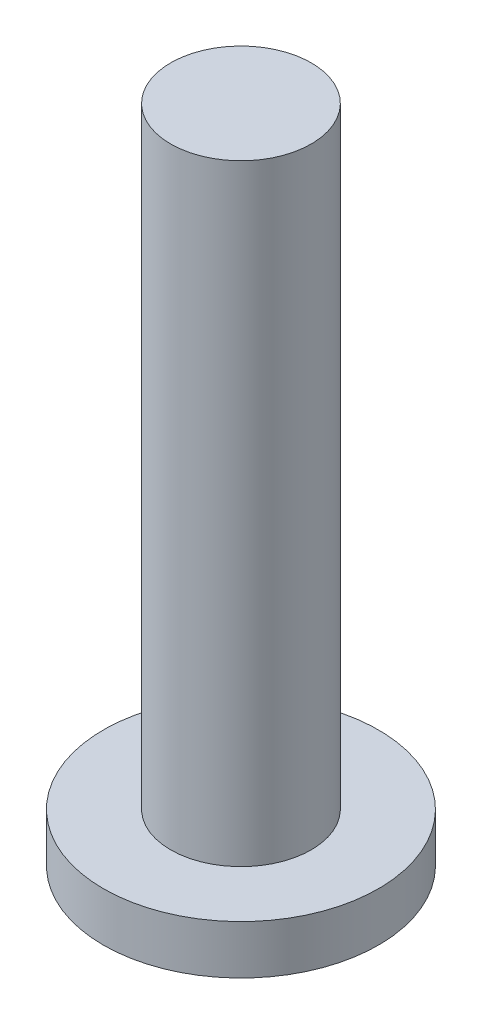
ISO-10303-21;
HEADER;
FILE_DESCRIPTION(('STEP AP214'),'2;1');
FILE_NAME('part.step','',(''),(''),'','','');
FILE_SCHEMA(('AUTOMOTIVE_DESIGN { 1 0 10303 214 1 1 1 1 }'));
ENDSEC;
DATA;
#1=APPLICATION_CONTEXT('core data for automotive mechanical design processes');
#2=APPLICATION_PROTOCOL_DEFINITION('international standard','automotive_design',2000,#1);
#3=PRODUCT_CONTEXT('',#1,'mechanical');
#4=PRODUCT('Part','Part','',(#3));
#5=PRODUCT_RELATED_PRODUCT_CATEGORY('part','',(#4));
#6=PRODUCT_DEFINITION_FORMATION('','',#4);
#7=PRODUCT_DEFINITION_CONTEXT('part definition',#1,'design');
#8=PRODUCT_DEFINITION('design','',#6,#7);
#9=PRODUCT_DEFINITION_SHAPE('','',#8);
#10=(LENGTH_UNIT() NAMED_UNIT(*) SI_UNIT(.MILLI.,.METRE.));
#11=(NAMED_UNIT(*) PLANE_ANGLE_UNIT() SI_UNIT($,.RADIAN.));
#12=(NAMED_UNIT(*) SI_UNIT($,.STERADIAN.) SOLID_ANGLE_UNIT());
#13=UNCERTAINTY_MEASURE_WITH_UNIT(LENGTH_MEASURE(1.E-05),#10,'distance_accuracy_value','');
#14=(GEOMETRIC_REPRESENTATION_CONTEXT(3) GLOBAL_UNCERTAINTY_ASSIGNED_CONTEXT((#13)) GLOBAL_UNIT_ASSIGNED_CONTEXT((#10,
#11,#12)) REPRESENTATION_CONTEXT('',''));
#15=CARTESIAN_POINT('',(0.,0.,0.));
#16=DIRECTION('',(0.,0.,1.));
#17=DIRECTION('',(1.,0.,0.));
#18=AXIS2_PLACEMENT_3D('',#15,#16,#17);
#19=CARTESIAN_POINT('',(0.,1.016,0.));
#20=DIRECTION('',(0.,1.,0.));
#21=DIRECTION('',(0.,0.,1.));
#22=AXIS2_PLACEMENT_3D('',#19,#20,#21);
#23=PLANE('',#22);
#24=CARTESIAN_POINT('',(0.,1.016,0.));
#25=DIRECTION('',(0.,1.,0.));
#26=DIRECTION('',(0.,0.,1.));
#27=AXIS2_PLACEMENT_3D('',#24,#25,#26);
#28=CIRCLE('',#27,2.8575);
#29=CARTESIAN_POINT('',(0.,1.016,2.8575));
#30=VERTEX_POINT('',#29);
#31=EDGE_CURVE('E10',#30,#30,#28,.T.);
#32=ORIENTED_EDGE('',*,*,#31,.T.);
#33=EDGE_LOOP('',(#32));
#34=FACE_BOUND('',#33,.T.);
#35=CARTESIAN_POINT('',(0.,1.016,0.));
#36=DIRECTION('',(0.,1.,0.));
#37=DIRECTION('',(0.,0.,1.));
#38=AXIS2_PLACEMENT_3D('',#35,#36,#37);
#39=CIRCLE('',#38,1.4605);
#40=CARTESIAN_POINT('',(0.,1.016,1.4605));
#41=VERTEX_POINT('',#40);
#42=EDGE_CURVE('E46',#41,#41,#39,.T.);
#43=ORIENTED_EDGE('',*,*,#42,.F.);
#44=EDGE_LOOP('',(#43));
#45=FACE_BOUND('',#44,.T.);
#46=ADVANCED_FACE('F35',(#34,#45),#23,.T.);
#47=CARTESIAN_POINT('',(0.,0.,0.));
#48=DIRECTION('',(0.,1.,0.));
#49=DIRECTION('',(0.,0.,1.));
#50=AXIS2_PLACEMENT_3D('',#47,#48,#49);
#51=PLANE('',#50);
#52=CARTESIAN_POINT('',(0.,0.,0.));
#53=DIRECTION('',(0.,1.,0.));
#54=DIRECTION('',(0.,0.,1.));
#55=AXIS2_PLACEMENT_3D('',#52,#53,#54);
#56=CIRCLE('',#55,2.8575);
#57=CARTESIAN_POINT('',(0.,0.,2.8575));
#58=VERTEX_POINT('',#57);
#59=EDGE_CURVE('E39',#58,#58,#56,.T.);
#60=ORIENTED_EDGE('',*,*,#59,.F.);
#61=EDGE_LOOP('',(#60));
#62=FACE_BOUND('',#61,.T.);
#63=ADVANCED_FACE('F65',(#62),#51,.F.);
#64=CARTESIAN_POINT('',(0.,1.016,0.));
#65=DIRECTION('',(0.,-1.,0.));
#66=DIRECTION('',(0.,0.,-1.));
#67=AXIS2_PLACEMENT_3D('',#64,#65,#66);
#68=CYLINDRICAL_SURFACE('',#67,2.8575);
#69=ORIENTED_EDGE('',*,*,#31,.F.);
#70=EDGE_LOOP('',(#69));
#71=FACE_BOUND('',#70,.T.);
#72=ORIENTED_EDGE('',*,*,#59,.T.);
#73=EDGE_LOOP('',(#72));
#74=FACE_BOUND('',#73,.T.);
#75=ADVANCED_FACE('F37',(#71,#74),#68,.T.);
#76=CARTESIAN_POINT('',(0.,13.716,0.));
#77=DIRECTION('',(0.,-1.,0.));
#78=DIRECTION('',(0.,0.,-1.));
#79=AXIS2_PLACEMENT_3D('',#76,#77,#78);
#80=CYLINDRICAL_SURFACE('',#79,1.4605);
#81=ORIENTED_EDGE('',*,*,#42,.T.);
#82=EDGE_LOOP('',(#81));
#83=FACE_BOUND('',#82,.T.);
#84=CARTESIAN_POINT('',(0.,13.716,0.));
#85=DIRECTION('',(0.,1.,0.));
#86=DIRECTION('',(0.,0.,1.));
#87=AXIS2_PLACEMENT_3D('',#84,#85,#86);
#88=CIRCLE('',#87,1.4605);
#89=CARTESIAN_POINT('',(0.,13.716,1.4605));
#90=VERTEX_POINT('',#89);
#91=EDGE_CURVE('E50',#90,#90,#88,.T.);
#92=ORIENTED_EDGE('',*,*,#91,.F.);
#93=EDGE_LOOP('',(#92));
#94=FACE_BOUND('',#93,.T.);
#95=ADVANCED_FACE('F56',(#83,#94),#80,.T.);
#96=CARTESIAN_POINT('',(0.,13.716,0.));
#97=DIRECTION('',(0.,1.,0.));
#98=DIRECTION('',(0.,0.,1.));
#99=AXIS2_PLACEMENT_3D('',#96,#97,#98);
#100=PLANE('',#99);
#101=ORIENTED_EDGE('',*,*,#91,.T.);
#102=EDGE_LOOP('',(#101));
#103=FACE_BOUND('',#102,.T.);
#104=ADVANCED_FACE('F54',(#103),#100,.T.);
#105=CLOSED_SHELL('',(#46,#63,#75,#95,#104));
#106=MANIFOLD_SOLID_BREP('B2',#105);
#107=ADVANCED_BREP_SHAPE_REPRESENTATION('',(#18,#106),#14);
#108=SHAPE_DEFINITION_REPRESENTATION(#9,#107);
ENDSEC;
END-ISO-10303-21;
